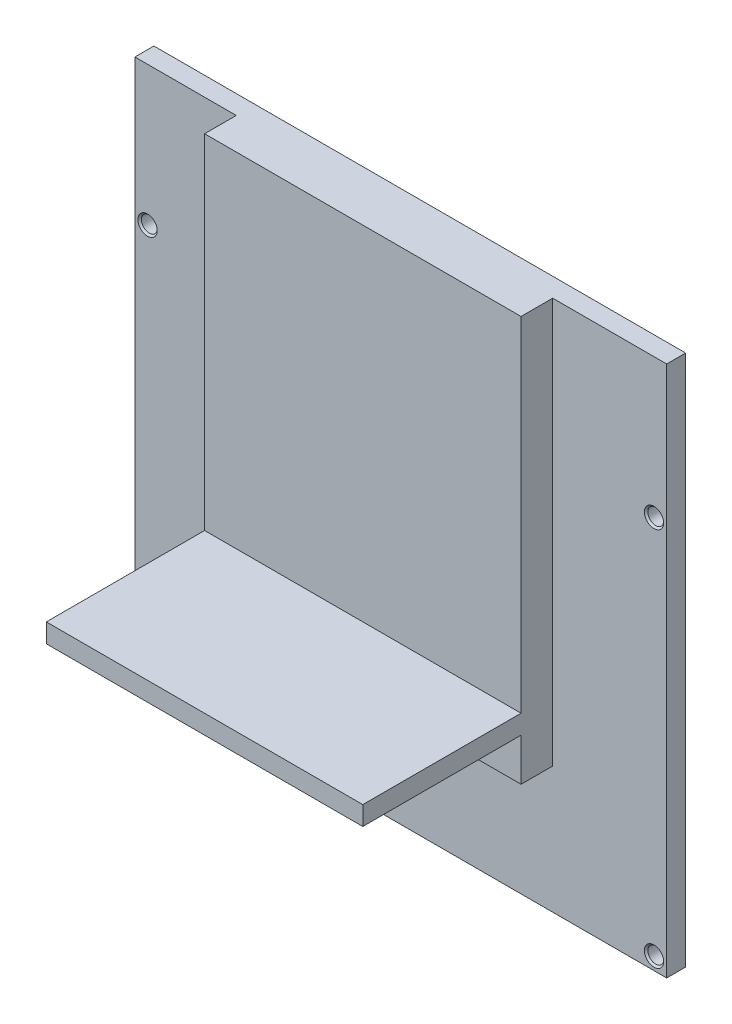
ISO-10303-21;
HEADER;
FILE_DESCRIPTION(('STEP AP214'),'2;1');
FILE_NAME('part.step','',(''),(''),'','','');
FILE_SCHEMA(('AUTOMOTIVE_DESIGN { 1 0 10303 214 1 1 1 1 }'));
ENDSEC;
DATA;
#1=APPLICATION_CONTEXT('core data for automotive mechanical design processes');
#2=APPLICATION_PROTOCOL_DEFINITION('international standard','automotive_design',2000,#1);
#3=PRODUCT_CONTEXT('',#1,'mechanical');
#4=PRODUCT('Part','Part','',(#3));
#5=PRODUCT_RELATED_PRODUCT_CATEGORY('part','',(#4));
#6=PRODUCT_DEFINITION_FORMATION('','',#4);
#7=PRODUCT_DEFINITION_CONTEXT('part definition',#1,'design');
#8=PRODUCT_DEFINITION('design','',#6,#7);
#9=PRODUCT_DEFINITION_SHAPE('','',#8);
#10=(LENGTH_UNIT() NAMED_UNIT(*) SI_UNIT(.MILLI.,.METRE.));
#11=(NAMED_UNIT(*) PLANE_ANGLE_UNIT() SI_UNIT($,.RADIAN.));
#12=(NAMED_UNIT(*) SI_UNIT($,.STERADIAN.) SOLID_ANGLE_UNIT());
#13=UNCERTAINTY_MEASURE_WITH_UNIT(LENGTH_MEASURE(1.E-05),#10,'distance_accuracy_value','');
#14=(GEOMETRIC_REPRESENTATION_CONTEXT(3) GLOBAL_UNCERTAINTY_ASSIGNED_CONTEXT((#13)) GLOBAL_UNIT_ASSIGNED_CONTEXT((#10,
#11,#12)) REPRESENTATION_CONTEXT('',''));
#15=CARTESIAN_POINT('',(0.,0.,0.));
#16=DIRECTION('',(0.,0.,1.));
#17=DIRECTION('',(1.,0.,0.));
#18=AXIS2_PLACEMENT_3D('',#15,#16,#17);
#19=CARTESIAN_POINT('',(-3.13256955810148,-45.4353101399616,3.));
#20=DIRECTION('',(0.,1.,0.));
#21=DIRECTION('',(0.,0.,1.));
#22=AXIS2_PLACEMENT_3D('',#19,#20,#21);
#23=PLANE('',#22);
#24=DIRECTION('',(-1.,0.,0.));
#25=VECTOR('',#24,1.);
#26=CARTESIAN_POINT('',(-45.1325695581015,-45.4353101399616,3.));
#27=LINE('',#26,#25);
#28=CARTESIAN_POINT('',(20.8624669382489,-45.4353101399616,3.));
#29=VERTEX_POINT('',#28);
#30=CARTESIAN_POINT('',(-29.1276060544518,-45.4353101399615,3.));
#31=VERTEX_POINT('',#30);
#32=EDGE_CURVE('E11',#29,#31,#27,.T.);
#33=ORIENTED_EDGE('',*,*,#32,.F.);
#34=DIRECTION('',(0.,0.,1.));
#35=VECTOR('',#34,1.);
#36=CARTESIAN_POINT('',(20.8624669382489,-45.4353101399616,3.));
#37=LINE('',#36,#35);
#38=CARTESIAN_POINT('',(20.8624669382489,-45.4353101399616,8.));
#39=VERTEX_POINT('',#38);
#40=EDGE_CURVE('E195',#29,#39,#37,.T.);
#41=ORIENTED_EDGE('',*,*,#40,.T.);
#42=DIRECTION('',(1.,0.,0.));
#43=VECTOR('',#42,1.);
#44=CARTESIAN_POINT('',(-29.1276060544518,-45.4353101399616,8.));
#45=LINE('',#44,#43);
#46=CARTESIAN_POINT('',(-29.1276060544518,-45.4353101399616,8.));
#47=VERTEX_POINT('',#46);
#48=EDGE_CURVE('E169',#47,#39,#45,.T.);
#49=ORIENTED_EDGE('',*,*,#48,.F.);
#50=DIRECTION('',(0.,0.,-1.));
#51=VECTOR('',#50,1.);
#52=CARTESIAN_POINT('',(-29.1276060544518,-45.4353101399616,8.));
#53=LINE('',#52,#51);
#54=EDGE_CURVE('E146',#47,#31,#53,.T.);
#55=ORIENTED_EDGE('',*,*,#54,.T.);
#56=EDGE_LOOP('',(#33,#41,#49,#55));
#57=FACE_BOUND('',#56,.T.);
#58=ADVANCED_FACE('F42',(#57),#23,.F.);
#59=CARTESIAN_POINT('',(20.8624669382489,18.5646898600385,8.));
#60=DIRECTION('',(-1.,0.,0.));
#61=DIRECTION('',(0.,-1.,0.));
#62=AXIS2_PLACEMENT_3D('',#59,#60,#61);
#63=PLANE('',#62);
#64=DIRECTION('',(0.,-1.,0.));
#65=VECTOR('',#64,1.);
#66=CARTESIAN_POINT('',(20.8624669382489,18.5646898600385,8.));
#67=LINE('',#66,#65);
#68=CARTESIAN_POINT('',(20.8624669382489,-38.7153101399615,8.));
#69=VERTEX_POINT('',#68);
#70=EDGE_CURVE('E59',#69,#39,#67,.T.);
#71=ORIENTED_EDGE('',*,*,#70,.T.);
#72=ORIENTED_EDGE('',*,*,#40,.F.);
#73=DIRECTION('',(0.,-1.,0.));
#74=VECTOR('',#73,1.);
#75=CARTESIAN_POINT('',(20.8624669382489,18.5646898600385,3.));
#76=LINE('',#75,#74);
#77=CARTESIAN_POINT('',(20.8624669382489,18.5646898600385,3.));
#78=VERTEX_POINT('',#77);
#79=EDGE_CURVE('E227',#78,#29,#76,.T.);
#80=ORIENTED_EDGE('',*,*,#79,.F.);
#81=DIRECTION('',(0.,0.,-1.));
#82=VECTOR('',#81,1.);
#83=CARTESIAN_POINT('',(20.8624669382489,18.5646898600385,8.));
#84=LINE('',#83,#82);
#85=CARTESIAN_POINT('',(20.8624669382489,18.5646898600385,8.));
#86=VERTEX_POINT('',#85);
#87=EDGE_CURVE('E209',#86,#78,#84,.T.);
#88=ORIENTED_EDGE('',*,*,#87,.F.);
#89=CARTESIAN_POINT('',(20.8624669382489,-35.7153101399615,8.));
#90=VERTEX_POINT('',#89);
#91=EDGE_CURVE('E214',#86,#90,#67,.T.);
#92=ORIENTED_EDGE('',*,*,#91,.T.);
#93=DIRECTION('',(0.,0.,-1.));
#94=VECTOR('',#93,1.);
#95=CARTESIAN_POINT('',(20.8624669382489,-35.7153101399615,33.));
#96=LINE('',#95,#94);
#97=CARTESIAN_POINT('',(20.8624669382489,-35.7153101399615,33.));
#98=VERTEX_POINT('',#97);
#99=EDGE_CURVE('E173',#98,#90,#96,.T.);
#100=ORIENTED_EDGE('',*,*,#99,.F.);
#101=DIRECTION('',(0.,-1.,0.));
#102=VECTOR('',#101,1.);
#103=CARTESIAN_POINT('',(20.8624669382489,-35.7153101399615,33.));
#104=LINE('',#103,#102);
#105=CARTESIAN_POINT('',(20.8624669382489,-38.7153101399615,33.));
#106=VERTEX_POINT('',#105);
#107=EDGE_CURVE('E182',#98,#106,#104,.T.);
#108=ORIENTED_EDGE('',*,*,#107,.T.);
#109=DIRECTION('',(0.,0.,-1.));
#110=VECTOR('',#109,1.);
#111=CARTESIAN_POINT('',(20.8624669382489,-38.7153101399615,33.));
#112=LINE('',#111,#110);
#113=EDGE_CURVE('E172',#106,#69,#112,.T.);
#114=ORIENTED_EDGE('',*,*,#113,.T.);
#115=EDGE_LOOP('',(#71,#72,#80,#88,#92,#100,#108,#114));
#116=FACE_BOUND('',#115,.T.);
#117=ADVANCED_FACE('F252',(#116),#63,.F.);
#118=CARTESIAN_POINT('',(-29.1276060544518,18.5646898600384,8.));
#119=DIRECTION('',(1.,0.,0.));
#120=DIRECTION('',(0.,1.,0.));
#121=AXIS2_PLACEMENT_3D('',#118,#119,#120);
#122=PLANE('',#121);
#123=ORIENTED_EDGE('',*,*,#54,.F.);
#124=DIRECTION('',(0.,-1.,0.));
#125=VECTOR('',#124,1.);
#126=CARTESIAN_POINT('',(-29.1276060544518,18.5646898600384,8.));
#127=LINE('',#126,#125);
#128=CARTESIAN_POINT('',(-29.1276060544518,-38.7153101399615,8.));
#129=VERTEX_POINT('',#128);
#130=EDGE_CURVE('E220',#129,#47,#127,.T.);
#131=ORIENTED_EDGE('',*,*,#130,.F.);
#132=DIRECTION('',(0.,0.,1.));
#133=VECTOR('',#132,1.);
#134=CARTESIAN_POINT('',(-29.1276060544518,-38.7153101399615,8.));
#135=LINE('',#134,#133);
#136=CARTESIAN_POINT('',(-29.1276060544518,-38.7153101399615,33.));
#137=VERTEX_POINT('',#136);
#138=EDGE_CURVE('E187',#129,#137,#135,.T.);
#139=ORIENTED_EDGE('',*,*,#138,.T.);
#140=DIRECTION('',(0.,-1.,0.));
#141=VECTOR('',#140,1.);
#142=CARTESIAN_POINT('',(-29.1276060544518,-35.7153101399615,33.));
#143=LINE('',#142,#141);
#144=CARTESIAN_POINT('',(-29.1276060544518,-35.7153101399615,33.));
#145=VERTEX_POINT('',#144);
#146=EDGE_CURVE('E192',#145,#137,#143,.T.);
#147=ORIENTED_EDGE('',*,*,#146,.F.);
#148=DIRECTION('',(0.,0.,1.));
#149=VECTOR('',#148,1.);
#150=CARTESIAN_POINT('',(-29.1276060544518,-35.7153101399615,8.));
#151=LINE('',#150,#149);
#152=CARTESIAN_POINT('',(-29.1276060544518,-35.7153101399615,8.));
#153=VERTEX_POINT('',#152);
#154=EDGE_CURVE('E178',#153,#145,#151,.T.);
#155=ORIENTED_EDGE('',*,*,#154,.F.);
#156=CARTESIAN_POINT('',(-29.1276060544518,18.5646898600384,8.));
#157=VERTEX_POINT('',#156);
#158=EDGE_CURVE('E218',#157,#153,#127,.T.);
#159=ORIENTED_EDGE('',*,*,#158,.F.);
#160=DIRECTION('',(0.,0.,1.));
#161=VECTOR('',#160,1.);
#162=CARTESIAN_POINT('',(-29.1276060544518,18.5646898600384,8.));
#163=LINE('',#162,#161);
#164=CARTESIAN_POINT('',(-29.1276060544518,18.5646898600384,3.));
#165=VERTEX_POINT('',#164);
#166=EDGE_CURVE('E213',#165,#157,#163,.T.);
#167=ORIENTED_EDGE('',*,*,#166,.F.);
#168=DIRECTION('',(0.,-1.,0.));
#169=VECTOR('',#168,1.);
#170=CARTESIAN_POINT('',(-29.1276060544518,18.5646898600384,3.));
#171=LINE('',#170,#169);
#172=EDGE_CURVE('E217',#165,#31,#171,.T.);
#173=ORIENTED_EDGE('',*,*,#172,.T.);
#174=EDGE_LOOP('',(#123,#131,#139,#147,#155,#159,#167,#173));
#175=FACE_BOUND('',#174,.T.);
#176=ADVANCED_FACE('F242',(#175),#122,.F.);
#177=CARTESIAN_POINT('',(0.,0.,8.));
#178=DIRECTION('',(0.,0.,-1.));
#179=DIRECTION('',(-1.,0.,0.));
#180=AXIS2_PLACEMENT_3D('',#177,#178,#179);
#181=PLANE('',#180);
#182=DIRECTION('',(-1.,0.,0.));
#183=VECTOR('',#182,1.);
#184=CARTESIAN_POINT('',(20.8624669382489,-38.7153101399615,8.));
#185=LINE('',#184,#183);
#186=EDGE_CURVE('E185',#69,#129,#185,.T.);
#187=ORIENTED_EDGE('',*,*,#186,.T.);
#188=ORIENTED_EDGE('',*,*,#130,.T.);
#189=ORIENTED_EDGE('',*,*,#48,.T.);
#190=ORIENTED_EDGE('',*,*,#70,.F.);
#191=EDGE_LOOP('',(#187,#188,#189,#190));
#192=FACE_BOUND('',#191,.T.);
#193=ADVANCED_FACE('F258',(#192),#181,.F.);
#194=ORIENTED_EDGE('',*,*,#158,.T.);
#195=DIRECTION('',(-1.,0.,0.));
#196=VECTOR('',#195,1.);
#197=CARTESIAN_POINT('',(20.8624669382489,-35.7153101399615,8.));
#198=LINE('',#197,#196);
#199=EDGE_CURVE('E67',#90,#153,#198,.T.);
#200=ORIENTED_EDGE('',*,*,#199,.F.);
#201=ORIENTED_EDGE('',*,*,#91,.F.);
#202=DIRECTION('',(-1.,0.,0.));
#203=VECTOR('',#202,1.);
#204=CARTESIAN_POINT('',(-35.1325695581015,18.5646898600384,8.));
#205=LINE('',#204,#203);
#206=EDGE_CURVE('E51',#86,#157,#205,.T.);
#207=ORIENTED_EDGE('',*,*,#206,.T.);
#208=EDGE_LOOP('',(#194,#200,#201,#207));
#209=FACE_BOUND('',#208,.T.);
#210=ADVANCED_FACE('F245',(#209),#181,.F.);
#211=CARTESIAN_POINT('',(-32.1325695581015,18.5646898600384,3.));
#212=DIRECTION('',(0.,0.,-1.));
#213=DIRECTION('',(-1.,0.,0.));
#214=AXIS2_PLACEMENT_3D('',#211,#212,#213);
#215=PLANE('',#214);
#216=CARTESIAN_POINT('',(-43.1325695581015,-3.43531013996157,3.));
#217=DIRECTION('',(0.,0.,1.));
#218=DIRECTION('',(1.,0.,0.));
#219=AXIS2_PLACEMENT_3D('',#216,#217,#218);
#220=CIRCLE('',#219,1.525);
#221=CARTESIAN_POINT('',(-41.6075695581015,-3.43531013996157,3.));
#222=VERTEX_POINT('',#221);
#223=EDGE_CURVE('E337',#222,#222,#220,.T.);
#224=ORIENTED_EDGE('',*,*,#223,.F.);
#225=EDGE_LOOP('',(#224));
#226=FACE_BOUND('',#225,.T.);
#227=CARTESIAN_POINT('',(36.8674304418985,-3.43531013996155,3.));
#228=DIRECTION('',(0.,0.,1.));
#229=DIRECTION('',(1.,0.,0.));
#230=AXIS2_PLACEMENT_3D('',#227,#228,#229);
#231=CIRCLE('',#230,1.525);
#232=CARTESIAN_POINT('',(38.3924304418985,-3.43531013996155,3.));
#233=VERTEX_POINT('',#232);
#234=EDGE_CURVE('E330',#233,#233,#231,.T.);
#235=ORIENTED_EDGE('',*,*,#234,.F.);
#236=EDGE_LOOP('',(#235));
#237=FACE_BOUND('',#236,.T.);
#238=CARTESIAN_POINT('',(36.8674304418985,-63.4353101399616,3.));
#239=DIRECTION('',(0.,0.,1.));
#240=DIRECTION('',(1.,0.,0.));
#241=AXIS2_PLACEMENT_3D('',#238,#239,#240);
#242=CIRCLE('',#241,1.525);
#243=CARTESIAN_POINT('',(38.3924304418985,-63.4353101399616,3.));
#244=VERTEX_POINT('',#243);
#245=EDGE_CURVE('E323',#244,#244,#242,.T.);
#246=ORIENTED_EDGE('',*,*,#245,.F.);
#247=EDGE_LOOP('',(#246));
#248=FACE_BOUND('',#247,.T.);
#249=CARTESIAN_POINT('',(-43.1325695581015,-63.4353101399616,3.));
#250=DIRECTION('',(0.,0.,1.));
#251=DIRECTION('',(1.,0.,0.));
#252=AXIS2_PLACEMENT_3D('',#249,#250,#251);
#253=CIRCLE('',#252,1.525);
#254=CARTESIAN_POINT('',(-41.6075695581015,-63.4353101399616,3.));
#255=VERTEX_POINT('',#254);
#256=EDGE_CURVE('E315',#255,#255,#253,.T.);
#257=ORIENTED_EDGE('',*,*,#256,.F.);
#258=EDGE_LOOP('',(#257));
#259=FACE_BOUND('',#258,.T.);
#260=DIRECTION('',(0.,-1.,0.));
#261=VECTOR('',#260,1.);
#262=CARTESIAN_POINT('',(-45.1325695581015,18.5646898600385,3.));
#263=LINE('',#262,#261);
#264=CARTESIAN_POINT('',(-45.1325695581015,18.5646898600385,3.));
#265=VERTEX_POINT('',#264);
#266=CARTESIAN_POINT('',(-45.1325695581015,-65.4353101399616,3.));
#267=VERTEX_POINT('',#266);
#268=EDGE_CURVE('E199',#265,#267,#263,.T.);
#269=ORIENTED_EDGE('',*,*,#268,.T.);
#270=DIRECTION('',(-1.,0.,0.));
#271=VECTOR('',#270,1.);
#272=CARTESIAN_POINT('',(-45.1325695581015,-65.4353101399616,3.));
#273=LINE('',#272,#271);
#274=CARTESIAN_POINT('',(38.8674304418985,-65.4353101399616,3.));
#275=VERTEX_POINT('',#274);
#276=EDGE_CURVE('E160',#275,#267,#273,.T.);
#277=ORIENTED_EDGE('',*,*,#276,.F.);
#278=DIRECTION('',(0.,1.,0.));
#279=VECTOR('',#278,1.);
#280=CARTESIAN_POINT('',(38.8674304418985,-45.4353101399616,3.));
#281=LINE('',#280,#279);
#282=CARTESIAN_POINT('',(38.8674304418985,18.5646898600384,3.));
#283=VERTEX_POINT('',#282);
#284=EDGE_CURVE('E201',#275,#283,#281,.T.);
#285=ORIENTED_EDGE('',*,*,#284,.T.);
#286=DIRECTION('',(1.,0.,0.));
#287=VECTOR('',#286,1.);
#288=CARTESIAN_POINT('',(20.8624669382489,18.5646898600385,3.));
#289=LINE('',#288,#287);
#290=EDGE_CURVE('E225',#78,#283,#289,.T.);
#291=ORIENTED_EDGE('',*,*,#290,.F.);
#292=ORIENTED_EDGE('',*,*,#79,.T.);
#293=ORIENTED_EDGE('',*,*,#32,.T.);
#294=ORIENTED_EDGE('',*,*,#172,.F.);
#295=DIRECTION('',(1.,0.,0.));
#296=VECTOR('',#295,1.);
#297=CARTESIAN_POINT('',(-32.1325695581015,18.5646898600384,3.));
#298=LINE('',#297,#296);
#299=EDGE_CURVE('E210',#265,#165,#298,.T.);
#300=ORIENTED_EDGE('',*,*,#299,.F.);
#301=EDGE_LOOP('',(#269,#277,#285,#291,#292,#293,#294,#300));
#302=FACE_BOUND('',#301,.T.);
#303=ADVANCED_FACE('F237',(#226,#237,#248,#259,#302),#215,.F.);
#304=CARTESIAN_POINT('',(-35.1325695581015,18.5646898600384,8.));
#305=DIRECTION('',(0.,-1.,0.));
#306=DIRECTION('',(0.,0.,-1.));
#307=AXIS2_PLACEMENT_3D('',#304,#305,#306);
#308=PLANE('',#307);
#309=ORIENTED_EDGE('',*,*,#290,.T.);
#310=DIRECTION('',(0.,0.,-1.));
#311=VECTOR('',#310,1.);
#312=CARTESIAN_POINT('',(38.8674304418985,18.5646898600384,3.));
#313=LINE('',#312,#311);
#314=CARTESIAN_POINT('',(38.8674304418985,18.5646898600384,0.));
#315=VERTEX_POINT('',#314);
#316=EDGE_CURVE('E203',#283,#315,#313,.T.);
#317=ORIENTED_EDGE('',*,*,#316,.T.);
#318=DIRECTION('',(-1.,0.,0.));
#319=VECTOR('',#318,1.);
#320=CARTESIAN_POINT('',(-35.1325695581015,18.5646898600384,0.));
#321=LINE('',#320,#319);
#322=CARTESIAN_POINT('',(-45.1325695581015,18.5646898600385,0.));
#323=VERTEX_POINT('',#322);
#324=EDGE_CURVE('E46',#315,#323,#321,.T.);
#325=ORIENTED_EDGE('',*,*,#324,.T.);
#326=DIRECTION('',(0.,0.,-1.));
#327=VECTOR('',#326,1.);
#328=CARTESIAN_POINT('',(-45.1325695581015,18.5646898600385,3.));
#329=LINE('',#328,#327);
#330=EDGE_CURVE('E143',#265,#323,#329,.T.);
#331=ORIENTED_EDGE('',*,*,#330,.F.);
#332=ORIENTED_EDGE('',*,*,#299,.T.);
#333=ORIENTED_EDGE('',*,*,#166,.T.);
#334=ORIENTED_EDGE('',*,*,#206,.F.);
#335=ORIENTED_EDGE('',*,*,#87,.T.);
#336=EDGE_LOOP('',(#309,#317,#325,#331,#332,#333,#334,#335));
#337=FACE_BOUND('',#336,.T.);
#338=ADVANCED_FACE('F44',(#337),#308,.F.);
#339=CARTESIAN_POINT('',(0.,0.,0.));
#340=DIRECTION('',(0.,0.,-1.));
#341=DIRECTION('',(-1.,0.,0.));
#342=AXIS2_PLACEMENT_3D('',#339,#340,#341);
#343=PLANE('',#342);
#344=CARTESIAN_POINT('',(-43.1325695581015,-3.43531013996157,0.));
#345=DIRECTION('',(0.,0.,1.));
#346=DIRECTION('',(1.,0.,0.));
#347=AXIS2_PLACEMENT_3D('',#344,#345,#346);
#348=CIRCLE('',#347,1.24999999999999);
#349=CARTESIAN_POINT('',(-41.8825695581015,-3.43531013996157,0.));
#350=VERTEX_POINT('',#349);
#351=EDGE_CURVE('E296',#350,#350,#348,.T.);
#352=ORIENTED_EDGE('',*,*,#351,.T.);
#353=EDGE_LOOP('',(#352));
#354=FACE_BOUND('',#353,.T.);
#355=CARTESIAN_POINT('',(36.8674304418985,-3.43531013996155,0.));
#356=DIRECTION('',(0.,0.,1.));
#357=DIRECTION('',(1.,0.,0.));
#358=AXIS2_PLACEMENT_3D('',#355,#356,#357);
#359=CIRCLE('',#358,1.24999999999999);
#360=CARTESIAN_POINT('',(38.1174304418985,-3.43531013996155,0.));
#361=VERTEX_POINT('',#360);
#362=EDGE_CURVE('E300',#361,#361,#359,.T.);
#363=ORIENTED_EDGE('',*,*,#362,.T.);
#364=EDGE_LOOP('',(#363));
#365=FACE_BOUND('',#364,.T.);
#366=CARTESIAN_POINT('',(36.8674304418985,-63.4353101399616,0.));
#367=DIRECTION('',(0.,0.,1.));
#368=DIRECTION('',(1.,0.,0.));
#369=AXIS2_PLACEMENT_3D('',#366,#367,#368);
#370=CIRCLE('',#369,1.24999999999999);
#371=CARTESIAN_POINT('',(38.1174304418985,-63.4353101399616,0.));
#372=VERTEX_POINT('',#371);
#373=EDGE_CURVE('E304',#372,#372,#370,.T.);
#374=ORIENTED_EDGE('',*,*,#373,.T.);
#375=EDGE_LOOP('',(#374));
#376=FACE_BOUND('',#375,.T.);
#377=CARTESIAN_POINT('',(-43.1325695581015,-63.4353101399616,0.));
#378=DIRECTION('',(0.,0.,1.));
#379=DIRECTION('',(1.,0.,0.));
#380=AXIS2_PLACEMENT_3D('',#377,#378,#379);
#381=CIRCLE('',#380,1.24999999999999);
#382=CARTESIAN_POINT('',(-41.8825695581015,-63.4353101399616,0.));
#383=VERTEX_POINT('',#382);
#384=EDGE_CURVE('E161',#383,#383,#381,.T.);
#385=ORIENTED_EDGE('',*,*,#384,.T.);
#386=EDGE_LOOP('',(#385));
#387=FACE_BOUND('',#386,.T.);
#388=DIRECTION('',(0.,-1.,0.));
#389=VECTOR('',#388,1.);
#390=CARTESIAN_POINT('',(-45.1325695581015,18.5646898600385,0.));
#391=LINE('',#390,#389);
#392=CARTESIAN_POINT('',(-45.1325695581015,-65.4353101399616,0.));
#393=VERTEX_POINT('',#392);
#394=EDGE_CURVE('E136',#323,#393,#391,.T.);
#395=ORIENTED_EDGE('',*,*,#394,.F.);
#396=ORIENTED_EDGE('',*,*,#324,.F.);
#397=DIRECTION('',(0.,1.,0.));
#398=VECTOR('',#397,1.);
#399=CARTESIAN_POINT('',(38.8674304418985,-45.4353101399616,0.));
#400=LINE('',#399,#398);
#401=CARTESIAN_POINT('',(38.8674304418985,-65.4353101399616,0.));
#402=VERTEX_POINT('',#401);
#403=EDGE_CURVE('E145',#402,#315,#400,.T.);
#404=ORIENTED_EDGE('',*,*,#403,.F.);
#405=DIRECTION('',(1.,0.,0.));
#406=VECTOR('',#405,1.);
#407=CARTESIAN_POINT('',(-45.1325695581015,-65.4353101399616,0.));
#408=LINE('',#407,#406);
#409=EDGE_CURVE('E149',#393,#402,#408,.T.);
#410=ORIENTED_EDGE('',*,*,#409,.F.);
#411=EDGE_LOOP('',(#395,#396,#404,#410));
#412=FACE_BOUND('',#411,.T.);
#413=ADVANCED_FACE('F150',(#354,#365,#376,#387,#412),#343,.T.);
#414=CARTESIAN_POINT('',(-45.1325695581015,18.5646898600385,3.));
#415=DIRECTION('',(1.,0.,0.));
#416=DIRECTION('',(0.,1.,0.));
#417=AXIS2_PLACEMENT_3D('',#414,#415,#416);
#418=PLANE('',#417);
#419=ORIENTED_EDGE('',*,*,#394,.T.);
#420=DIRECTION('',(0.,0.,-1.));
#421=VECTOR('',#420,1.);
#422=CARTESIAN_POINT('',(-45.1325695581015,-65.4353101399616,3.));
#423=LINE('',#422,#421);
#424=EDGE_CURVE('E141',#267,#393,#423,.T.);
#425=ORIENTED_EDGE('',*,*,#424,.F.);
#426=ORIENTED_EDGE('',*,*,#268,.F.);
#427=ORIENTED_EDGE('',*,*,#330,.T.);
#428=EDGE_LOOP('',(#419,#425,#426,#427));
#429=FACE_BOUND('',#428,.T.);
#430=ADVANCED_FACE('F138',(#429),#418,.F.);
#431=CARTESIAN_POINT('',(38.8674304418985,-45.4353101399616,3.));
#432=DIRECTION('',(-1.,0.,0.));
#433=DIRECTION('',(0.,0.,1.));
#434=AXIS2_PLACEMENT_3D('',#431,#432,#433);
#435=PLANE('',#434);
#436=ORIENTED_EDGE('',*,*,#403,.T.);
#437=ORIENTED_EDGE('',*,*,#316,.F.);
#438=ORIENTED_EDGE('',*,*,#284,.F.);
#439=DIRECTION('',(0.,0.,1.));
#440=VECTOR('',#439,1.);
#441=CARTESIAN_POINT('',(38.8674304418985,-65.4353101399616,3.));
#442=LINE('',#441,#440);
#443=EDGE_CURVE('E155',#402,#275,#442,.T.);
#444=ORIENTED_EDGE('',*,*,#443,.F.);
#445=EDGE_LOOP('',(#436,#437,#438,#444));
#446=FACE_BOUND('',#445,.T.);
#447=ADVANCED_FACE('F235',(#446),#435,.F.);
#448=CARTESIAN_POINT('',(-29.1276060544518,-35.7153101399615,33.));
#449=DIRECTION('',(0.,0.,-1.));
#450=DIRECTION('',(-1.,0.,0.));
#451=AXIS2_PLACEMENT_3D('',#448,#449,#450);
#452=PLANE('',#451);
#453=DIRECTION('',(1.,0.,0.));
#454=VECTOR('',#453,1.);
#455=CARTESIAN_POINT('',(-29.1276060544518,-38.7153101399615,33.));
#456=LINE('',#455,#454);
#457=EDGE_CURVE('E176',#137,#106,#456,.T.);
#458=ORIENTED_EDGE('',*,*,#457,.T.);
#459=ORIENTED_EDGE('',*,*,#107,.F.);
#460=DIRECTION('',(1.,0.,0.));
#461=VECTOR('',#460,1.);
#462=CARTESIAN_POINT('',(-29.1276060544518,-35.7153101399615,33.));
#463=LINE('',#462,#461);
#464=EDGE_CURVE('E180',#145,#98,#463,.T.);
#465=ORIENTED_EDGE('',*,*,#464,.F.);
#466=ORIENTED_EDGE('',*,*,#146,.T.);
#467=EDGE_LOOP('',(#458,#459,#465,#466));
#468=FACE_BOUND('',#467,.T.);
#469=ADVANCED_FACE('F263',(#468),#452,.F.);
#470=CARTESIAN_POINT('',(0.,-35.7153101399615,0.));
#471=DIRECTION('',(0.,1.,0.));
#472=DIRECTION('',(0.,0.,1.));
#473=AXIS2_PLACEMENT_3D('',#470,#471,#472);
#474=PLANE('',#473);
#475=ORIENTED_EDGE('',*,*,#99,.T.);
#476=ORIENTED_EDGE('',*,*,#199,.T.);
#477=ORIENTED_EDGE('',*,*,#154,.T.);
#478=ORIENTED_EDGE('',*,*,#464,.T.);
#479=EDGE_LOOP('',(#475,#476,#477,#478));
#480=FACE_BOUND('',#479,.T.);
#481=ADVANCED_FACE('F247',(#480),#474,.T.);
#482=CARTESIAN_POINT('',(0.,-38.7153101399615,0.));
#483=DIRECTION('',(0.,1.,0.));
#484=DIRECTION('',(0.,0.,1.));
#485=AXIS2_PLACEMENT_3D('',#482,#483,#484);
#486=PLANE('',#485);
#487=ORIENTED_EDGE('',*,*,#113,.F.);
#488=ORIENTED_EDGE('',*,*,#457,.F.);
#489=ORIENTED_EDGE('',*,*,#138,.F.);
#490=ORIENTED_EDGE('',*,*,#186,.F.);
#491=EDGE_LOOP('',(#487,#488,#489,#490));
#492=FACE_BOUND('',#491,.T.);
#493=ADVANCED_FACE('F261',(#492),#486,.F.);
#494=CARTESIAN_POINT('',(0.,-65.4353101399616,0.));
#495=DIRECTION('',(0.,-1.,0.));
#496=DIRECTION('',(0.,0.,-1.));
#497=AXIS2_PLACEMENT_3D('',#494,#495,#496);
#498=PLANE('',#497);
#499=ORIENTED_EDGE('',*,*,#424,.T.);
#500=ORIENTED_EDGE('',*,*,#409,.T.);
#501=ORIENTED_EDGE('',*,*,#443,.T.);
#502=ORIENTED_EDGE('',*,*,#276,.T.);
#503=EDGE_LOOP('',(#499,#500,#501,#502));
#504=FACE_BOUND('',#503,.T.);
#505=ADVANCED_FACE('F158',(#504),#498,.T.);
#506=CARTESIAN_POINT('',(-43.1325695581015,-63.4353101399616,3.));
#507=DIRECTION('',(0.,0.,1.));
#508=DIRECTION('',(1.,0.,0.));
#509=AXIS2_PLACEMENT_3D('',#506,#507,#508);
#510=CYLINDRICAL_SURFACE('',#509,1.24999999999999);
#511=ORIENTED_EDGE('',*,*,#384,.F.);
#512=EDGE_LOOP('',(#511));
#513=FACE_BOUND('',#512,.T.);
#514=CARTESIAN_POINT('',(-43.1325695581015,-63.4353101399616,2.72499999999999));
#515=DIRECTION('',(0.,0.,1.));
#516=DIRECTION('',(1.,0.,0.));
#517=AXIS2_PLACEMENT_3D('',#514,#515,#516);
#518=CIRCLE('',#517,1.24999999999999);
#519=CARTESIAN_POINT('',(-41.8825695581015,-63.4353101399616,2.72499999999999));
#520=VERTEX_POINT('',#519);
#521=EDGE_CURVE('E164',#520,#520,#518,.T.);
#522=ORIENTED_EDGE('',*,*,#521,.T.);
#523=EDGE_LOOP('',(#522));
#524=FACE_BOUND('',#523,.T.);
#525=ADVANCED_FACE('F307',(#513,#524),#510,.F.);
#526=CARTESIAN_POINT('',(-43.1325695581015,-63.4353101399616,3.));
#527=DIRECTION('',(0.,0.,1.));
#528=DIRECTION('',(1.,0.,0.));
#529=AXIS2_PLACEMENT_3D('',#526,#527,#528);
#530=CONICAL_SURFACE('',#529,1.525,0.785398163397445);
#531=ORIENTED_EDGE('',*,*,#521,.F.);
#532=EDGE_LOOP('',(#531));
#533=FACE_BOUND('',#532,.T.);
#534=ORIENTED_EDGE('',*,*,#256,.T.);
#535=EDGE_LOOP('',(#534));
#536=FACE_BOUND('',#535,.T.);
#537=ADVANCED_FACE('F310',(#533,#536),#530,.F.);
#538=CARTESIAN_POINT('',(36.8674304418985,-63.4353101399616,3.));
#539=DIRECTION('',(0.,0.,1.));
#540=DIRECTION('',(1.,0.,0.));
#541=AXIS2_PLACEMENT_3D('',#538,#539,#540);
#542=CYLINDRICAL_SURFACE('',#541,1.24999999999999);
#543=ORIENTED_EDGE('',*,*,#373,.F.);
#544=EDGE_LOOP('',(#543));
#545=FACE_BOUND('',#544,.T.);
#546=CARTESIAN_POINT('',(36.8674304418985,-63.4353101399616,2.72499999999999));
#547=DIRECTION('',(0.,0.,1.));
#548=DIRECTION('',(1.,0.,0.));
#549=AXIS2_PLACEMENT_3D('',#546,#547,#548);
#550=CIRCLE('',#549,1.24999999999999);
#551=CARTESIAN_POINT('',(38.1174304418985,-63.4353101399616,2.72499999999999));
#552=VERTEX_POINT('',#551);
#553=EDGE_CURVE('E320',#552,#552,#550,.T.);
#554=ORIENTED_EDGE('',*,*,#553,.T.);
#555=EDGE_LOOP('',(#554));
#556=FACE_BOUND('',#555,.T.);
#557=ADVANCED_FACE('F350',(#545,#556),#542,.F.);
#558=CARTESIAN_POINT('',(36.8674304418985,-63.4353101399616,3.));
#559=DIRECTION('',(0.,0.,1.));
#560=DIRECTION('',(1.,0.,0.));
#561=AXIS2_PLACEMENT_3D('',#558,#559,#560);
#562=CONICAL_SURFACE('',#561,1.525,0.785398163397445);
#563=ORIENTED_EDGE('',*,*,#553,.F.);
#564=EDGE_LOOP('',(#563));
#565=FACE_BOUND('',#564,.T.);
#566=ORIENTED_EDGE('',*,*,#245,.T.);
#567=EDGE_LOOP('',(#566));
#568=FACE_BOUND('',#567,.T.);
#569=ADVANCED_FACE('F355',(#565,#568),#562,.F.);
#570=CARTESIAN_POINT('',(36.8674304418985,-3.43531013996155,3.));
#571=DIRECTION('',(0.,0.,1.));
#572=DIRECTION('',(1.,0.,0.));
#573=AXIS2_PLACEMENT_3D('',#570,#571,#572);
#574=CYLINDRICAL_SURFACE('',#573,1.24999999999999);
#575=ORIENTED_EDGE('',*,*,#362,.F.);
#576=EDGE_LOOP('',(#575));
#577=FACE_BOUND('',#576,.T.);
#578=CARTESIAN_POINT('',(36.8674304418985,-3.43531013996155,2.72499999999999));
#579=DIRECTION('',(0.,0.,1.));
#580=DIRECTION('',(1.,0.,0.));
#581=AXIS2_PLACEMENT_3D('',#578,#579,#580);
#582=CIRCLE('',#581,1.24999999999999);
#583=CARTESIAN_POINT('',(38.1174304418985,-3.43531013996155,2.72499999999999));
#584=VERTEX_POINT('',#583);
#585=EDGE_CURVE('E327',#584,#584,#582,.T.);
#586=ORIENTED_EDGE('',*,*,#585,.T.);
#587=EDGE_LOOP('',(#586));
#588=FACE_BOUND('',#587,.T.);
#589=ADVANCED_FACE('F397',(#577,#588),#574,.F.);
#590=CARTESIAN_POINT('',(36.8674304418985,-3.43531013996155,3.));
#591=DIRECTION('',(0.,0.,1.));
#592=DIRECTION('',(1.,0.,0.));
#593=AXIS2_PLACEMENT_3D('',#590,#591,#592);
#594=CONICAL_SURFACE('',#593,1.525,0.785398163397445);
#595=ORIENTED_EDGE('',*,*,#585,.F.);
#596=EDGE_LOOP('',(#595));
#597=FACE_BOUND('',#596,.T.);
#598=ORIENTED_EDGE('',*,*,#234,.T.);
#599=EDGE_LOOP('',(#598));
#600=FACE_BOUND('',#599,.T.);
#601=ADVANCED_FACE('F406',(#597,#600),#594,.F.);
#602=CARTESIAN_POINT('',(-43.1325695581015,-3.43531013996157,3.));
#603=DIRECTION('',(0.,0.,1.));
#604=DIRECTION('',(1.,0.,0.));
#605=AXIS2_PLACEMENT_3D('',#602,#603,#604);
#606=CYLINDRICAL_SURFACE('',#605,1.24999999999999);
#607=ORIENTED_EDGE('',*,*,#351,.F.);
#608=EDGE_LOOP('',(#607));
#609=FACE_BOUND('',#608,.T.);
#610=CARTESIAN_POINT('',(-43.1325695581015,-3.43531013996157,2.72499999999999));
#611=DIRECTION('',(0.,0.,1.));
#612=DIRECTION('',(1.,0.,0.));
#613=AXIS2_PLACEMENT_3D('',#610,#611,#612);
#614=CIRCLE('',#613,1.24999999999999);
#615=CARTESIAN_POINT('',(-41.8825695581015,-3.43531013996157,2.72499999999999));
#616=VERTEX_POINT('',#615);
#617=EDGE_CURVE('E334',#616,#616,#614,.T.);
#618=ORIENTED_EDGE('',*,*,#617,.T.);
#619=EDGE_LOOP('',(#618));
#620=FACE_BOUND('',#619,.T.);
#621=ADVANCED_FACE('F416',(#609,#620),#606,.F.);
#622=CARTESIAN_POINT('',(-43.1325695581015,-3.43531013996157,3.));
#623=DIRECTION('',(0.,0.,1.));
#624=DIRECTION('',(1.,0.,0.));
#625=AXIS2_PLACEMENT_3D('',#622,#623,#624);
#626=CONICAL_SURFACE('',#625,1.525,0.785398163397445);
#627=ORIENTED_EDGE('',*,*,#617,.F.);
#628=EDGE_LOOP('',(#627));
#629=FACE_BOUND('',#628,.T.);
#630=ORIENTED_EDGE('',*,*,#223,.T.);
#631=EDGE_LOOP('',(#630));
#632=FACE_BOUND('',#631,.T.);
#633=ADVANCED_FACE('F341',(#629,#632),#626,.F.);
#634=CLOSED_SHELL('',(#58,#117,#176,#193,#210,#303,#338,#413,#430,#447,#469,#481,#493,#505,#525,
#537,#557,#569,#589,#601,#621,#633));
#635=MANIFOLD_SOLID_BREP('B2',#634);
#636=ADVANCED_BREP_SHAPE_REPRESENTATION('',(#18,#635),#14);
#637=SHAPE_DEFINITION_REPRESENTATION(#9,#636);
ENDSEC;
END-ISO-10303-21;
